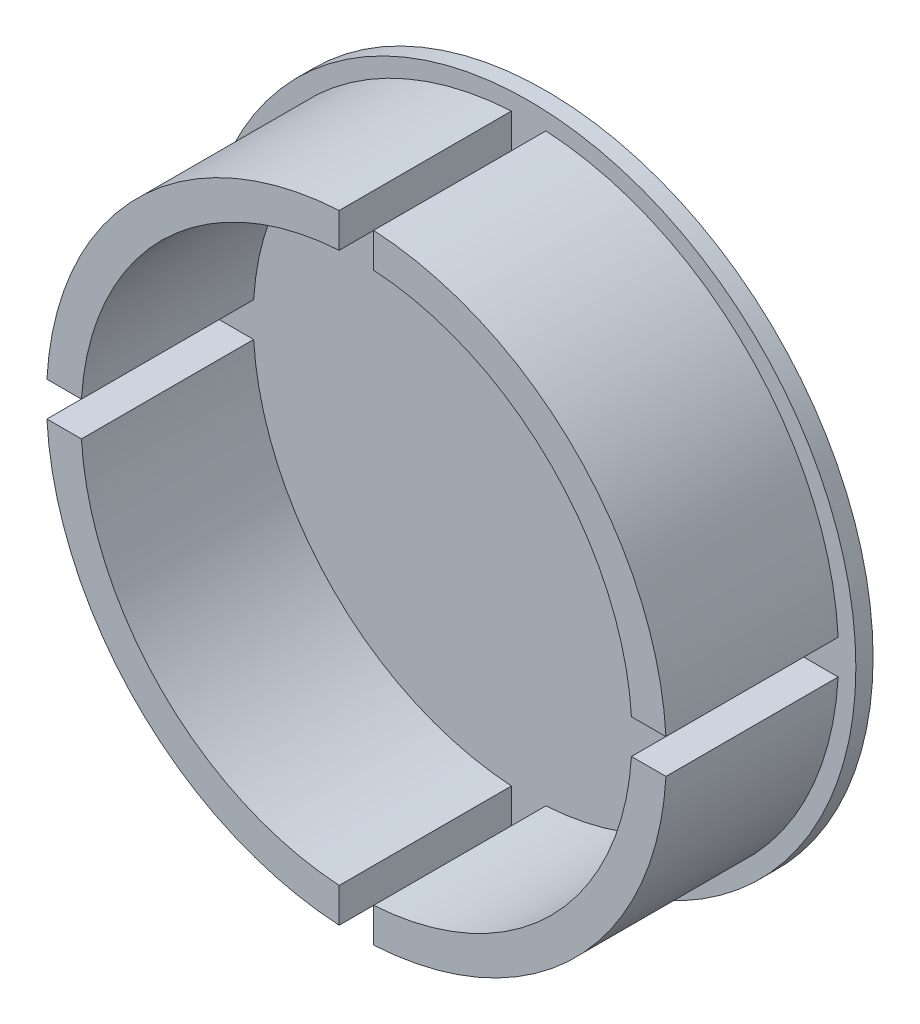
ISO-10303-21;
HEADER;
FILE_DESCRIPTION(('STEP AP214'),'2;1');
FILE_NAME('part.step','',(''),(''),'','','');
FILE_SCHEMA(('AUTOMOTIVE_DESIGN { 1 0 10303 214 1 1 1 1 }'));
ENDSEC;
DATA;
#1=APPLICATION_CONTEXT('core data for automotive mechanical design processes');
#2=APPLICATION_PROTOCOL_DEFINITION('international standard','automotive_design',2000,#1);
#3=PRODUCT_CONTEXT('',#1,'mechanical');
#4=PRODUCT('Part','Part','',(#3));
#5=PRODUCT_RELATED_PRODUCT_CATEGORY('part','',(#4));
#6=PRODUCT_DEFINITION_FORMATION('','',#4);
#7=PRODUCT_DEFINITION_CONTEXT('part definition',#1,'design');
#8=PRODUCT_DEFINITION('design','',#6,#7);
#9=PRODUCT_DEFINITION_SHAPE('','',#8);
#10=(LENGTH_UNIT() NAMED_UNIT(*) SI_UNIT(.MILLI.,.METRE.));
#11=(NAMED_UNIT(*) PLANE_ANGLE_UNIT() SI_UNIT($,.RADIAN.));
#12=(NAMED_UNIT(*) SI_UNIT($,.STERADIAN.) SOLID_ANGLE_UNIT());
#13=UNCERTAINTY_MEASURE_WITH_UNIT(LENGTH_MEASURE(1.E-05),#10,'distance_accuracy_value','');
#14=(GEOMETRIC_REPRESENTATION_CONTEXT(3) GLOBAL_UNCERTAINTY_ASSIGNED_CONTEXT((#13)) GLOBAL_UNIT_ASSIGNED_CONTEXT((#10,
#11,#12)) REPRESENTATION_CONTEXT('',''));
#15=CARTESIAN_POINT('',(0.,0.,0.));
#16=DIRECTION('',(0.,0.,1.));
#17=DIRECTION('',(1.,0.,0.));
#18=AXIS2_PLACEMENT_3D('',#15,#16,#17);
#19=CARTESIAN_POINT('',(0.,0.,11.));
#20=DIRECTION('',(0.,0.,1.));
#21=DIRECTION('',(1.,0.,0.));
#22=AXIS2_PLACEMENT_3D('',#19,#20,#21);
#23=PLANE('',#22);
#24=DIRECTION('',(0.,1.,0.));
#25=VECTOR('',#24,1.);
#26=CARTESIAN_POINT('',(1.,15.5,11.));
#27=LINE('',#26,#25);
#28=CARTESIAN_POINT('',(1.,15.9687194226713,11.));
#29=VERTEX_POINT('',#28);
#30=CARTESIAN_POINT('',(1.,17.9722007556114,11.));
#31=VERTEX_POINT('',#30);
#32=EDGE_CURVE('E299',#29,#31,#27,.T.);
#33=ORIENTED_EDGE('',*,*,#32,.F.);
#34=CARTESIAN_POINT('',(0.,0.,11.));
#35=DIRECTION('',(0.,0.,1.));
#36=DIRECTION('',(1.,0.,0.));
#37=AXIS2_PLACEMENT_3D('',#34,#35,#36);
#38=CIRCLE('',#37,16.);
#39=CARTESIAN_POINT('',(15.9687194226712,1.00000000000176,11.));
#40=VERTEX_POINT('',#39);
#41=EDGE_CURVE('E190',#40,#29,#38,.T.);
#42=ORIENTED_EDGE('',*,*,#41,.F.);
#43=DIRECTION('',(-1.,0.,0.));
#44=VECTOR('',#43,1.);
#45=CARTESIAN_POINT('',(15.5000000000019,1.00000000000176,11.));
#46=LINE('',#45,#44);
#47=CARTESIAN_POINT('',(17.9722007556113,1.00000000000176,11.));
#48=VERTEX_POINT('',#47);
#49=EDGE_CURVE('E296',#48,#40,#46,.T.);
#50=ORIENTED_EDGE('',*,*,#49,.F.);
#51=CARTESIAN_POINT('',(0.,0.,11.));
#52=DIRECTION('',(0.,0.,1.));
#53=DIRECTION('',(1.,0.,0.));
#54=AXIS2_PLACEMENT_3D('',#51,#52,#53);
#55=CIRCLE('',#54,18.);
#56=EDGE_CURVE('E195',#48,#31,#55,.T.);
#57=ORIENTED_EDGE('',*,*,#56,.T.);
#58=EDGE_LOOP('',(#33,#42,#50,#57));
#59=FACE_BOUND('',#58,.T.);
#60=ADVANCED_FACE('F41',(#59),#23,.T.);
#61=DIRECTION('',(1.,0.,0.));
#62=VECTOR('',#61,1.);
#63=CARTESIAN_POINT('',(15.5000000000019,-0.999999999998236,11.));
#64=LINE('',#63,#62);
#65=CARTESIAN_POINT('',(15.9687194226714,-0.999999999998236,11.));
#66=VERTEX_POINT('',#65);
#67=CARTESIAN_POINT('',(17.9722007556115,-0.999999999998235,11.));
#68=VERTEX_POINT('',#67);
#69=EDGE_CURVE('E297',#66,#68,#64,.T.);
#70=ORIENTED_EDGE('',*,*,#69,.F.);
#71=CARTESIAN_POINT('',(1.00000000000365,-15.9687194226711,11.));
#72=VERTEX_POINT('',#71);
#73=EDGE_CURVE('E265',#72,#66,#38,.T.);
#74=ORIENTED_EDGE('',*,*,#73,.F.);
#75=DIRECTION('',(0.,1.,0.));
#76=VECTOR('',#75,1.);
#77=CARTESIAN_POINT('',(1.00000000000365,-15.5000000000001,11.));
#78=LINE('',#77,#76);
#79=CARTESIAN_POINT('',(1.00000000000365,-17.9722007556112,11.));
#80=VERTEX_POINT('',#79);
#81=EDGE_CURVE('E308',#80,#72,#78,.T.);
#82=ORIENTED_EDGE('',*,*,#81,.F.);
#83=EDGE_CURVE('E194',#80,#68,#55,.T.);
#84=ORIENTED_EDGE('',*,*,#83,.T.);
#85=EDGE_LOOP('',(#70,#74,#82,#84));
#86=FACE_BOUND('',#85,.T.);
#87=ADVANCED_FACE('F321',(#86),#23,.T.);
#88=DIRECTION('',(0.,-1.,0.));
#89=VECTOR('',#88,1.);
#90=CARTESIAN_POINT('',(-0.99999999999635,-15.5000000000001,11.));
#91=LINE('',#90,#89);
#92=CARTESIAN_POINT('',(-0.99999999999635,-15.9687194226715,11.));
#93=VERTEX_POINT('',#92);
#94=CARTESIAN_POINT('',(-0.999999999996349,-17.9722007556116,11.));
#95=VERTEX_POINT('',#94);
#96=EDGE_CURVE('E219',#93,#95,#91,.T.);
#97=ORIENTED_EDGE('',*,*,#96,.F.);
#98=CARTESIAN_POINT('',(-15.9687194226712,-1.00000000000189,11.));
#99=VERTEX_POINT('',#98);
#100=EDGE_CURVE('E221',#99,#93,#38,.T.);
#101=ORIENTED_EDGE('',*,*,#100,.F.);
#102=DIRECTION('',(1.,0.,0.));
#103=VECTOR('',#102,1.);
#104=CARTESIAN_POINT('',(-15.4999999999982,-1.00000000000189,11.));
#105=LINE('',#104,#103);
#106=CARTESIAN_POINT('',(-17.9722007556113,-1.00000000000189,11.));
#107=VERTEX_POINT('',#106);
#108=EDGE_CURVE('E167',#107,#99,#105,.T.);
#109=ORIENTED_EDGE('',*,*,#108,.F.);
#110=EDGE_CURVE('E177',#107,#95,#55,.T.);
#111=ORIENTED_EDGE('',*,*,#110,.T.);
#112=EDGE_LOOP('',(#97,#101,#109,#111));
#113=FACE_BOUND('',#112,.T.);
#114=ADVANCED_FACE('F217',(#113),#23,.T.);
#115=CARTESIAN_POINT('',(0.,0.,11.));
#116=DIRECTION('',(0.,0.,-1.));
#117=DIRECTION('',(-1.,0.,0.));
#118=AXIS2_PLACEMENT_3D('',#115,#116,#117);
#119=CYLINDRICAL_SURFACE('',#118,18.);
#120=CARTESIAN_POINT('',(0.,0.,1.));
#121=DIRECTION('',(0.,0.,1.));
#122=DIRECTION('',(1.,0.,0.));
#123=AXIS2_PLACEMENT_3D('',#120,#121,#122);
#124=CIRCLE('',#123,18.);
#125=CARTESIAN_POINT('',(17.9722007556113,1.00000000000176,1.));
#126=VERTEX_POINT('',#125);
#127=CARTESIAN_POINT('',(1.,17.9722007556114,1.));
#128=VERTEX_POINT('',#127);
#129=EDGE_CURVE('E188',#126,#128,#124,.T.);
#130=ORIENTED_EDGE('',*,*,#129,.T.);
#131=DIRECTION('',(0.,0.,-1.));
#132=VECTOR('',#131,1.);
#133=CARTESIAN_POINT('',(1.,17.9722007556114,11.));
#134=LINE('',#133,#132);
#135=EDGE_CURVE('E263',#128,#31,#134,.F.);
#136=ORIENTED_EDGE('',*,*,#135,.T.);
#137=ORIENTED_EDGE('',*,*,#56,.F.);
#138=DIRECTION('',(0.,0.,-1.));
#139=VECTOR('',#138,1.);
#140=CARTESIAN_POINT('',(17.9722007556113,1.00000000000176,11.));
#141=LINE('',#140,#139);
#142=EDGE_CURVE('E248',#48,#126,#141,.T.);
#143=ORIENTED_EDGE('',*,*,#142,.T.);
#144=EDGE_LOOP('',(#130,#136,#137,#143));
#145=FACE_BOUND('',#144,.T.);
#146=ADVANCED_FACE('F293',(#145),#119,.T.);
#147=CARTESIAN_POINT('',(1.00000000000365,-17.9722007556112,1.));
#148=VERTEX_POINT('',#147);
#149=CARTESIAN_POINT('',(17.9722007556115,-0.999999999998235,1.));
#150=VERTEX_POINT('',#149);
#151=EDGE_CURVE('E185',#148,#150,#124,.T.);
#152=ORIENTED_EDGE('',*,*,#151,.T.);
#153=DIRECTION('',(0.,0.,-1.));
#154=VECTOR('',#153,1.);
#155=CARTESIAN_POINT('',(17.9722007556115,-0.999999999998235,11.));
#156=LINE('',#155,#154);
#157=EDGE_CURVE('E253',#150,#68,#156,.F.);
#158=ORIENTED_EDGE('',*,*,#157,.T.);
#159=ORIENTED_EDGE('',*,*,#83,.F.);
#160=DIRECTION('',(0.,0.,-1.));
#161=VECTOR('',#160,1.);
#162=CARTESIAN_POINT('',(1.00000000000365,-17.9722007556112,11.));
#163=LINE('',#162,#161);
#164=EDGE_CURVE('E239',#80,#148,#163,.T.);
#165=ORIENTED_EDGE('',*,*,#164,.T.);
#166=EDGE_LOOP('',(#152,#158,#159,#165));
#167=FACE_BOUND('',#166,.T.);
#168=ADVANCED_FACE('F316',(#167),#119,.T.);
#169=CARTESIAN_POINT('',(-17.9722007556113,-1.00000000000189,1.));
#170=VERTEX_POINT('',#169);
#171=CARTESIAN_POINT('',(-0.999999999996349,-17.9722007556116,1.));
#172=VERTEX_POINT('',#171);
#173=EDGE_CURVE('E175',#170,#172,#124,.T.);
#174=ORIENTED_EDGE('',*,*,#173,.T.);
#175=DIRECTION('',(0.,0.,-1.));
#176=VECTOR('',#175,1.);
#177=CARTESIAN_POINT('',(-0.999999999996349,-17.9722007556116,11.));
#178=LINE('',#177,#176);
#179=EDGE_CURVE('E244',#172,#95,#178,.F.);
#180=ORIENTED_EDGE('',*,*,#179,.T.);
#181=ORIENTED_EDGE('',*,*,#110,.F.);
#182=DIRECTION('',(0.,0.,-1.));
#183=VECTOR('',#182,1.);
#184=CARTESIAN_POINT('',(-17.9722007556113,-1.00000000000189,11.));
#185=LINE('',#184,#183);
#186=EDGE_CURVE('E159',#107,#170,#185,.T.);
#187=ORIENTED_EDGE('',*,*,#186,.T.);
#188=EDGE_LOOP('',(#174,#180,#181,#187));
#189=FACE_BOUND('',#188,.T.);
#190=ADVANCED_FACE('F173',(#189),#119,.T.);
#191=CARTESIAN_POINT('',(0.,0.,11.));
#192=DIRECTION('',(0.,0.,-1.));
#193=DIRECTION('',(-1.,0.,0.));
#194=AXIS2_PLACEMENT_3D('',#191,#192,#193);
#195=CYLINDRICAL_SURFACE('',#194,16.);
#196=DIRECTION('',(0.,0.,-1.));
#197=VECTOR('',#196,1.);
#198=CARTESIAN_POINT('',(1.,15.9687194226713,11.));
#199=LINE('',#198,#197);
#200=CARTESIAN_POINT('',(1.,15.9687194226713,1.));
#201=VERTEX_POINT('',#200);
#202=EDGE_CURVE('E261',#201,#29,#199,.F.);
#203=ORIENTED_EDGE('',*,*,#202,.F.);
#204=CARTESIAN_POINT('',(0.,0.,1.));
#205=DIRECTION('',(0.,0.,1.));
#206=DIRECTION('',(1.,0.,0.));
#207=AXIS2_PLACEMENT_3D('',#204,#205,#206);
#208=CIRCLE('',#207,16.);
#209=CARTESIAN_POINT('',(15.9687194226712,1.00000000000176,1.));
#210=VERTEX_POINT('',#209);
#211=EDGE_CURVE('E50',#201,#210,#208,.F.);
#212=ORIENTED_EDGE('',*,*,#211,.T.);
#213=DIRECTION('',(0.,0.,-1.));
#214=VECTOR('',#213,1.);
#215=CARTESIAN_POINT('',(15.9687194226712,1.00000000000176,11.));
#216=LINE('',#215,#214);
#217=EDGE_CURVE('E246',#40,#210,#216,.T.);
#218=ORIENTED_EDGE('',*,*,#217,.F.);
#219=ORIENTED_EDGE('',*,*,#41,.T.);
#220=EDGE_LOOP('',(#203,#212,#218,#219));
#221=FACE_BOUND('',#220,.T.);
#222=ADVANCED_FACE('F287',(#221),#195,.F.);
#223=DIRECTION('',(0.,0.,-1.));
#224=VECTOR('',#223,1.);
#225=CARTESIAN_POINT('',(15.9687194226714,-0.999999999998236,11.));
#226=LINE('',#225,#224);
#227=CARTESIAN_POINT('',(15.9687194226714,-0.999999999998236,1.));
#228=VERTEX_POINT('',#227);
#229=EDGE_CURVE('E251',#228,#66,#226,.F.);
#230=ORIENTED_EDGE('',*,*,#229,.F.);
#231=CARTESIAN_POINT('',(1.00000000000365,-15.9687194226711,1.));
#232=VERTEX_POINT('',#231);
#233=EDGE_CURVE('E12',#228,#232,#208,.F.);
#234=ORIENTED_EDGE('',*,*,#233,.T.);
#235=DIRECTION('',(0.,0.,-1.));
#236=VECTOR('',#235,1.);
#237=CARTESIAN_POINT('',(1.00000000000365,-15.9687194226711,11.));
#238=LINE('',#237,#236);
#239=EDGE_CURVE('E236',#72,#232,#238,.T.);
#240=ORIENTED_EDGE('',*,*,#239,.F.);
#241=ORIENTED_EDGE('',*,*,#73,.T.);
#242=EDGE_LOOP('',(#230,#234,#240,#241));
#243=FACE_BOUND('',#242,.T.);
#244=ADVANCED_FACE('F320',(#243),#195,.F.);
#245=DIRECTION('',(0.,0.,-1.));
#246=VECTOR('',#245,1.);
#247=CARTESIAN_POINT('',(-0.99999999999635,-15.9687194226715,11.));
#248=LINE('',#247,#246);
#249=CARTESIAN_POINT('',(-0.99999999999635,-15.9687194226715,1.));
#250=VERTEX_POINT('',#249);
#251=EDGE_CURVE('E242',#250,#93,#248,.F.);
#252=ORIENTED_EDGE('',*,*,#251,.F.);
#253=CARTESIAN_POINT('',(-15.9687194226712,-1.00000000000189,1.));
#254=VERTEX_POINT('',#253);
#255=EDGE_CURVE('E49',#250,#254,#208,.F.);
#256=ORIENTED_EDGE('',*,*,#255,.T.);
#257=DIRECTION('',(0.,0.,-1.));
#258=VECTOR('',#257,1.);
#259=CARTESIAN_POINT('',(-15.9687194226712,-1.00000000000189,11.));
#260=LINE('',#259,#258);
#261=EDGE_CURVE('E162',#99,#254,#260,.T.);
#262=ORIENTED_EDGE('',*,*,#261,.F.);
#263=ORIENTED_EDGE('',*,*,#100,.T.);
#264=EDGE_LOOP('',(#252,#256,#262,#263));
#265=FACE_BOUND('',#264,.T.);
#266=ADVANCED_FACE('F280',(#265),#195,.F.);
#267=CARTESIAN_POINT('',(0.,0.,1.));
#268=DIRECTION('',(0.,0.,-1.));
#269=DIRECTION('',(-1.,0.,0.));
#270=AXIS2_PLACEMENT_3D('',#267,#268,#269);
#271=CYLINDRICAL_SURFACE('',#270,19.);
#272=CARTESIAN_POINT('',(0.,0.,1.));
#273=DIRECTION('',(0.,0.,1.));
#274=DIRECTION('',(1.,0.,0.));
#275=AXIS2_PLACEMENT_3D('',#272,#273,#274);
#276=CIRCLE('',#275,19.);
#277=CARTESIAN_POINT('',(19.,0.,1.));
#278=VERTEX_POINT('',#277);
#279=EDGE_CURVE('E197',#278,#278,#276,.T.);
#280=ORIENTED_EDGE('',*,*,#279,.F.);
#281=EDGE_LOOP('',(#280));
#282=FACE_BOUND('',#281,.T.);
#283=CARTESIAN_POINT('',(0.,0.,0.));
#284=DIRECTION('',(0.,0.,1.));
#285=DIRECTION('',(1.,0.,0.));
#286=AXIS2_PLACEMENT_3D('',#283,#284,#285);
#287=CIRCLE('',#286,19.);
#288=CARTESIAN_POINT('',(19.,0.,0.));
#289=VERTEX_POINT('',#288);
#290=EDGE_CURVE('E199',#289,#289,#287,.T.);
#291=ORIENTED_EDGE('',*,*,#290,.T.);
#292=EDGE_LOOP('',(#291));
#293=FACE_BOUND('',#292,.T.);
#294=ADVANCED_FACE('F43',(#282,#293),#271,.T.);
#295=CARTESIAN_POINT('',(0.,0.,1.));
#296=DIRECTION('',(0.,0.,1.));
#297=DIRECTION('',(1.,0.,0.));
#298=AXIS2_PLACEMENT_3D('',#295,#296,#297);
#299=PLANE('',#298);
#300=CARTESIAN_POINT('',(-0.999999999999999,17.9722007556114,1.));
#301=VERTEX_POINT('',#300);
#302=CARTESIAN_POINT('',(-17.9722007556115,0.999999999998112,1.));
#303=VERTEX_POINT('',#302);
#304=EDGE_CURVE('E184',#301,#303,#124,.T.);
#305=ORIENTED_EDGE('',*,*,#304,.F.);
#306=DIRECTION('',(0.,1.,0.));
#307=VECTOR('',#306,1.);
#308=CARTESIAN_POINT('',(-0.999999999999999,15.5,1.));
#309=LINE('',#308,#307);
#310=CARTESIAN_POINT('',(-0.999999999999999,15.9687194226713,1.));
#311=VERTEX_POINT('',#310);
#312=EDGE_CURVE('E65',#311,#301,#309,.T.);
#313=ORIENTED_EDGE('',*,*,#312,.F.);
#314=CARTESIAN_POINT('',(-15.9687194226714,0.999999999998112,1.));
#315=VERTEX_POINT('',#314);
#316=EDGE_CURVE('E281',#315,#311,#208,.F.);
#317=ORIENTED_EDGE('',*,*,#316,.F.);
#318=DIRECTION('',(1.,0.,0.));
#319=VECTOR('',#318,1.);
#320=CARTESIAN_POINT('',(-15.4999999999982,0.999999999998113,1.));
#321=LINE('',#320,#319);
#322=EDGE_CURVE('E168',#303,#315,#321,.T.);
#323=ORIENTED_EDGE('',*,*,#322,.F.);
#324=EDGE_LOOP('',(#305,#313,#317,#323));
#325=FACE_BOUND('',#324,.T.);
#326=ORIENTED_EDGE('',*,*,#129,.F.);
#327=DIRECTION('',(1.,0.,0.));
#328=VECTOR('',#327,1.);
#329=CARTESIAN_POINT('',(15.5000000000019,1.00000000000176,1.));
#330=LINE('',#329,#328);
#331=EDGE_CURVE('E57',#210,#126,#330,.T.);
#332=ORIENTED_EDGE('',*,*,#331,.F.);
#333=ORIENTED_EDGE('',*,*,#211,.F.);
#334=DIRECTION('',(0.,-1.,0.));
#335=VECTOR('',#334,1.);
#336=CARTESIAN_POINT('',(1.,15.5,1.));
#337=LINE('',#336,#335);
#338=EDGE_CURVE('E230',#128,#201,#337,.T.);
#339=ORIENTED_EDGE('',*,*,#338,.F.);
#340=EDGE_LOOP('',(#326,#332,#333,#339));
#341=FACE_BOUND('',#340,.T.);
#342=ORIENTED_EDGE('',*,*,#151,.F.);
#343=DIRECTION('',(0.,-1.,0.));
#344=VECTOR('',#343,1.);
#345=CARTESIAN_POINT('',(1.00000000000365,-15.5000000000001,1.));
#346=LINE('',#345,#344);
#347=EDGE_CURVE('E226',#232,#148,#346,.T.);
#348=ORIENTED_EDGE('',*,*,#347,.F.);
#349=ORIENTED_EDGE('',*,*,#233,.F.);
#350=DIRECTION('',(-1.,0.,0.));
#351=VECTOR('',#350,1.);
#352=CARTESIAN_POINT('',(15.5000000000019,-0.999999999998236,1.));
#353=LINE('',#352,#351);
#354=EDGE_CURVE('E301',#150,#228,#353,.T.);
#355=ORIENTED_EDGE('',*,*,#354,.F.);
#356=EDGE_LOOP('',(#342,#348,#349,#355));
#357=FACE_BOUND('',#356,.T.);
#358=ORIENTED_EDGE('',*,*,#173,.F.);
#359=DIRECTION('',(-1.,0.,0.));
#360=VECTOR('',#359,1.);
#361=CARTESIAN_POINT('',(-15.4999999999982,-1.00000000000189,1.));
#362=LINE('',#361,#360);
#363=EDGE_CURVE('E156',#254,#170,#362,.T.);
#364=ORIENTED_EDGE('',*,*,#363,.F.);
#365=ORIENTED_EDGE('',*,*,#255,.F.);
#366=DIRECTION('',(0.,1.,0.));
#367=VECTOR('',#366,1.);
#368=CARTESIAN_POINT('',(-0.99999999999635,-15.5000000000001,1.));
#369=LINE('',#368,#367);
#370=EDGE_CURVE('E183',#172,#250,#369,.T.);
#371=ORIENTED_EDGE('',*,*,#370,.F.);
#372=EDGE_LOOP('',(#358,#364,#365,#371));
#373=FACE_BOUND('',#372,.T.);
#374=ORIENTED_EDGE('',*,*,#279,.T.);
#375=EDGE_LOOP('',(#374));
#376=FACE_BOUND('',#375,.T.);
#377=ADVANCED_FACE('F181',(#325,#341,#357,#373,#376),#299,.T.);
#378=CARTESIAN_POINT('',(0.,0.,0.));
#379=DIRECTION('',(0.,0.,1.));
#380=DIRECTION('',(1.,0.,0.));
#381=AXIS2_PLACEMENT_3D('',#378,#379,#380);
#382=PLANE('',#381);
#383=ORIENTED_EDGE('',*,*,#290,.F.);
#384=EDGE_LOOP('',(#383));
#385=FACE_BOUND('',#384,.T.);
#386=ADVANCED_FACE('F333',(#385),#382,.F.);
#387=DIRECTION('',(0.,-1.,0.));
#388=VECTOR('',#387,1.);
#389=CARTESIAN_POINT('',(-0.999999999999999,15.5,11.));
#390=LINE('',#389,#388);
#391=CARTESIAN_POINT('',(-0.999999999999999,17.9722007556114,11.));
#392=VERTEX_POINT('',#391);
#393=CARTESIAN_POINT('',(-0.999999999999999,15.9687194226713,11.));
#394=VERTEX_POINT('',#393);
#395=EDGE_CURVE('E304',#392,#394,#390,.T.);
#396=ORIENTED_EDGE('',*,*,#395,.F.);
#397=CARTESIAN_POINT('',(-17.9722007556115,0.999999999998112,11.));
#398=VERTEX_POINT('',#397);
#399=EDGE_CURVE('E204',#392,#398,#55,.T.);
#400=ORIENTED_EDGE('',*,*,#399,.T.);
#401=DIRECTION('',(-1.,0.,0.));
#402=VECTOR('',#401,1.);
#403=CARTESIAN_POINT('',(-15.4999999999982,0.999999999998113,11.));
#404=LINE('',#403,#402);
#405=CARTESIAN_POINT('',(-15.9687194226714,0.999999999998112,11.));
#406=VERTEX_POINT('',#405);
#407=EDGE_CURVE('E222',#406,#398,#404,.T.);
#408=ORIENTED_EDGE('',*,*,#407,.F.);
#409=EDGE_CURVE('E267',#394,#406,#38,.T.);
#410=ORIENTED_EDGE('',*,*,#409,.F.);
#411=EDGE_LOOP('',(#396,#400,#408,#410));
#412=FACE_BOUND('',#411,.T.);
#413=ADVANCED_FACE('F328',(#412),#23,.T.);
#414=ORIENTED_EDGE('',*,*,#399,.F.);
#415=DIRECTION('',(0.,0.,-1.));
#416=VECTOR('',#415,1.);
#417=CARTESIAN_POINT('',(-0.999999999999999,17.9722007556114,11.));
#418=LINE('',#417,#416);
#419=EDGE_CURVE('E258',#392,#301,#418,.T.);
#420=ORIENTED_EDGE('',*,*,#419,.T.);
#421=ORIENTED_EDGE('',*,*,#304,.T.);
#422=DIRECTION('',(0.,0.,-1.));
#423=VECTOR('',#422,1.);
#424=CARTESIAN_POINT('',(-17.9722007556115,0.999999999998112,11.));
#425=LINE('',#424,#423);
#426=EDGE_CURVE('E233',#303,#398,#425,.F.);
#427=ORIENTED_EDGE('',*,*,#426,.T.);
#428=EDGE_LOOP('',(#414,#420,#421,#427));
#429=FACE_BOUND('',#428,.T.);
#430=ADVANCED_FACE('F332',(#429),#119,.T.);
#431=DIRECTION('',(0.,0.,-1.));
#432=VECTOR('',#431,1.);
#433=CARTESIAN_POINT('',(-0.999999999999999,15.9687194226713,11.));
#434=LINE('',#433,#432);
#435=EDGE_CURVE('E256',#394,#311,#434,.T.);
#436=ORIENTED_EDGE('',*,*,#435,.F.);
#437=ORIENTED_EDGE('',*,*,#409,.T.);
#438=DIRECTION('',(0.,0.,-1.));
#439=VECTOR('',#438,1.);
#440=CARTESIAN_POINT('',(-15.9687194226714,0.999999999998112,11.));
#441=LINE('',#440,#439);
#442=EDGE_CURVE('E178',#315,#406,#441,.F.);
#443=ORIENTED_EDGE('',*,*,#442,.F.);
#444=ORIENTED_EDGE('',*,*,#316,.T.);
#445=EDGE_LOOP('',(#436,#437,#443,#444));
#446=FACE_BOUND('',#445,.T.);
#447=ADVANCED_FACE('F335',(#446),#195,.F.);
#448=CARTESIAN_POINT('',(-15.4999999999982,0.999999999998113,-2.60555127546399));
#449=DIRECTION('',(0.,1.,0.));
#450=DIRECTION('',(-1.,0.,0.));
#451=AXIS2_PLACEMENT_3D('',#448,#449,#450);
#452=PLANE('',#451);
#453=ORIENTED_EDGE('',*,*,#322,.T.);
#454=ORIENTED_EDGE('',*,*,#442,.T.);
#455=ORIENTED_EDGE('',*,*,#407,.T.);
#456=ORIENTED_EDGE('',*,*,#426,.F.);
#457=EDGE_LOOP('',(#453,#454,#455,#456));
#458=FACE_BOUND('',#457,.T.);
#459=ADVANCED_FACE('F364',(#458),#452,.F.);
#460=CARTESIAN_POINT('',(-15.4999999999982,-1.00000000000189,-2.60555127546399));
#461=DIRECTION('',(0.,-1.,0.));
#462=DIRECTION('',(1.,0.,0.));
#463=AXIS2_PLACEMENT_3D('',#460,#461,#462);
#464=PLANE('',#463);
#465=ORIENTED_EDGE('',*,*,#108,.T.);
#466=ORIENTED_EDGE('',*,*,#261,.T.);
#467=ORIENTED_EDGE('',*,*,#363,.T.);
#468=ORIENTED_EDGE('',*,*,#186,.F.);
#469=EDGE_LOOP('',(#465,#466,#467,#468));
#470=FACE_BOUND('',#469,.T.);
#471=ADVANCED_FACE('F158',(#470),#464,.F.);
#472=CARTESIAN_POINT('',(-0.99999999999635,-15.5000000000001,-2.60555127546399));
#473=DIRECTION('',(-1.,0.,0.));
#474=DIRECTION('',(0.,-1.,0.));
#475=AXIS2_PLACEMENT_3D('',#472,#473,#474);
#476=PLANE('',#475);
#477=ORIENTED_EDGE('',*,*,#370,.T.);
#478=ORIENTED_EDGE('',*,*,#251,.T.);
#479=ORIENTED_EDGE('',*,*,#96,.T.);
#480=ORIENTED_EDGE('',*,*,#179,.F.);
#481=EDGE_LOOP('',(#477,#478,#479,#480));
#482=FACE_BOUND('',#481,.T.);
#483=ADVANCED_FACE('F377',(#482),#476,.F.);
#484=CARTESIAN_POINT('',(1.00000000000365,-15.5000000000001,-2.60555127546399));
#485=DIRECTION('',(1.,0.,0.));
#486=DIRECTION('',(0.,1.,0.));
#487=AXIS2_PLACEMENT_3D('',#484,#485,#486);
#488=PLANE('',#487);
#489=ORIENTED_EDGE('',*,*,#81,.T.);
#490=ORIENTED_EDGE('',*,*,#239,.T.);
#491=ORIENTED_EDGE('',*,*,#347,.T.);
#492=ORIENTED_EDGE('',*,*,#164,.F.);
#493=EDGE_LOOP('',(#489,#490,#491,#492));
#494=FACE_BOUND('',#493,.T.);
#495=ADVANCED_FACE('F312',(#494),#488,.F.);
#496=CARTESIAN_POINT('',(15.5000000000019,-0.999999999998236,-2.60555127546399));
#497=DIRECTION('',(0.,-1.,0.));
#498=DIRECTION('',(1.,0.,0.));
#499=AXIS2_PLACEMENT_3D('',#496,#497,#498);
#500=PLANE('',#499);
#501=ORIENTED_EDGE('',*,*,#354,.T.);
#502=ORIENTED_EDGE('',*,*,#229,.T.);
#503=ORIENTED_EDGE('',*,*,#69,.T.);
#504=ORIENTED_EDGE('',*,*,#157,.F.);
#505=EDGE_LOOP('',(#501,#502,#503,#504));
#506=FACE_BOUND('',#505,.T.);
#507=ADVANCED_FACE('F319',(#506),#500,.F.);
#508=CARTESIAN_POINT('',(15.5000000000019,1.00000000000176,-2.60555127546399));
#509=DIRECTION('',(0.,1.,0.));
#510=DIRECTION('',(-1.,0.,0.));
#511=AXIS2_PLACEMENT_3D('',#508,#509,#510);
#512=PLANE('',#511);
#513=ORIENTED_EDGE('',*,*,#49,.T.);
#514=ORIENTED_EDGE('',*,*,#217,.T.);
#515=ORIENTED_EDGE('',*,*,#331,.T.);
#516=ORIENTED_EDGE('',*,*,#142,.F.);
#517=EDGE_LOOP('',(#513,#514,#515,#516));
#518=FACE_BOUND('',#517,.T.);
#519=ADVANCED_FACE('F295',(#518),#512,.F.);
#520=CARTESIAN_POINT('',(1.,15.5,-2.60555127546399));
#521=DIRECTION('',(1.,0.,0.));
#522=DIRECTION('',(0.,1.,0.));
#523=AXIS2_PLACEMENT_3D('',#520,#521,#522);
#524=PLANE('',#523);
#525=ORIENTED_EDGE('',*,*,#338,.T.);
#526=ORIENTED_EDGE('',*,*,#202,.T.);
#527=ORIENTED_EDGE('',*,*,#32,.T.);
#528=ORIENTED_EDGE('',*,*,#135,.F.);
#529=EDGE_LOOP('',(#525,#526,#527,#528));
#530=FACE_BOUND('',#529,.T.);
#531=ADVANCED_FACE('F405',(#530),#524,.F.);
#532=CARTESIAN_POINT('',(-0.999999999999999,15.5,-2.60555127546399));
#533=DIRECTION('',(-1.,0.,0.));
#534=DIRECTION('',(0.,-1.,0.));
#535=AXIS2_PLACEMENT_3D('',#532,#533,#534);
#536=PLANE('',#535);
#537=ORIENTED_EDGE('',*,*,#395,.T.);
#538=ORIENTED_EDGE('',*,*,#435,.T.);
#539=ORIENTED_EDGE('',*,*,#312,.T.);
#540=ORIENTED_EDGE('',*,*,#419,.F.);
#541=EDGE_LOOP('',(#537,#538,#539,#540));
#542=FACE_BOUND('',#541,.T.);
#543=ADVANCED_FACE('F413',(#542),#536,.F.);
#544=CLOSED_SHELL('',(#60,#87,#114,#146,#168,#190,#222,#244,#266,#294,#377,#386,#413,#430,#447,
#459,#471,#483,#495,#507,#519,#531,#543));
#545=MANIFOLD_SOLID_BREP('B2',#544);
#546=ADVANCED_BREP_SHAPE_REPRESENTATION('',(#18,#545),#14);
#547=SHAPE_DEFINITION_REPRESENTATION(#9,#546);
ENDSEC;
END-ISO-10303-21;
